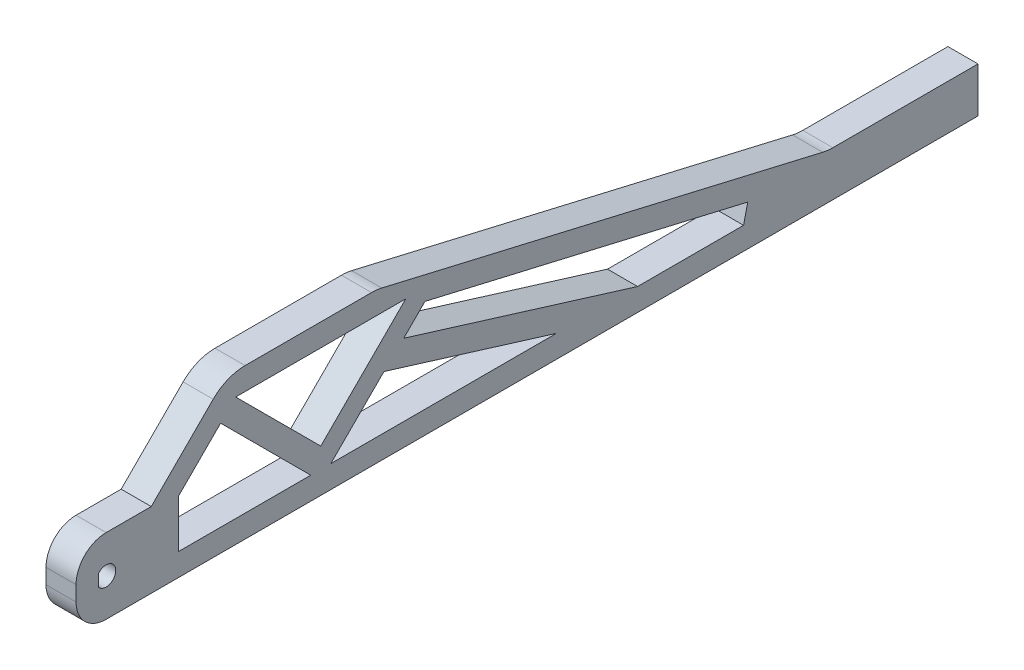
ISO-10303-21;
HEADER;
FILE_DESCRIPTION(('STEP AP214'),'2;1');
FILE_NAME('part.step','',(''),(''),'','','');
FILE_SCHEMA(('AUTOMOTIVE_DESIGN { 1 0 10303 214 1 1 1 1 }'));
ENDSEC;
DATA;
#1=APPLICATION_CONTEXT('core data for automotive mechanical design processes');
#2=APPLICATION_PROTOCOL_DEFINITION('international standard','automotive_design',2000,#1);
#3=PRODUCT_CONTEXT('',#1,'mechanical');
#4=PRODUCT('Part','Part','',(#3));
#5=PRODUCT_RELATED_PRODUCT_CATEGORY('part','',(#4));
#6=PRODUCT_DEFINITION_FORMATION('','',#4);
#7=PRODUCT_DEFINITION_CONTEXT('part definition',#1,'design');
#8=PRODUCT_DEFINITION('design','',#6,#7);
#9=PRODUCT_DEFINITION_SHAPE('','',#8);
#10=(LENGTH_UNIT() NAMED_UNIT(*) SI_UNIT(.MILLI.,.METRE.));
#11=(NAMED_UNIT(*) PLANE_ANGLE_UNIT() SI_UNIT($,.RADIAN.));
#12=(NAMED_UNIT(*) SI_UNIT($,.STERADIAN.) SOLID_ANGLE_UNIT());
#13=UNCERTAINTY_MEASURE_WITH_UNIT(LENGTH_MEASURE(1.E-05),#10,'distance_accuracy_value','');
#14=(GEOMETRIC_REPRESENTATION_CONTEXT(3) GLOBAL_UNCERTAINTY_ASSIGNED_CONTEXT((#13)) GLOBAL_UNIT_ASSIGNED_CONTEXT((#10,
#11,#12)) REPRESENTATION_CONTEXT('',''));
#15=CARTESIAN_POINT('',(0.,0.,0.));
#16=DIRECTION('',(0.,0.,1.));
#17=DIRECTION('',(1.,0.,0.));
#18=AXIS2_PLACEMENT_3D('',#15,#16,#17);
#19=CARTESIAN_POINT('',(-10.,0.,0.));
#20=DIRECTION('',(0.,0.,1.));
#21=DIRECTION('',(1.,0.,0.));
#22=AXIS2_PLACEMENT_3D('',#19,#20,#21);
#23=PLANE('',#22);
#24=DIRECTION('',(0.,-1.,0.));
#25=VECTOR('',#24,1.);
#26=CARTESIAN_POINT('',(-10.,0.,0.));
#27=LINE('',#26,#25);
#28=CARTESIAN_POINT('',(-10.,15.,0.));
#29=VERTEX_POINT('',#28);
#30=CARTESIAN_POINT('',(-10.,10.,0.));
#31=VERTEX_POINT('',#30);
#32=EDGE_CURVE('E379',#29,#31,#27,.T.);
#33=ORIENTED_EDGE('',*,*,#32,.T.);
#34=DIRECTION('',(1.,0.,0.));
#35=VECTOR('',#34,1.);
#36=CARTESIAN_POINT('',(-10.,10.,0.));
#37=LINE('',#36,#35);
#38=CARTESIAN_POINT('',(0.,10.,0.));
#39=VERTEX_POINT('',#38);
#40=EDGE_CURVE('E431',#31,#39,#37,.T.);
#41=ORIENTED_EDGE('',*,*,#40,.T.);
#42=DIRECTION('',(0.,-1.,0.));
#43=VECTOR('',#42,1.);
#44=CARTESIAN_POINT('',(0.,0.,0.));
#45=LINE('',#44,#43);
#46=CARTESIAN_POINT('',(0.,15.,0.));
#47=VERTEX_POINT('',#46);
#48=EDGE_CURVE('E374',#47,#39,#45,.T.);
#49=ORIENTED_EDGE('',*,*,#48,.F.);
#50=DIRECTION('',(1.,0.,0.));
#51=VECTOR('',#50,1.);
#52=CARTESIAN_POINT('',(-10.,15.,0.));
#53=LINE('',#52,#51);
#54=EDGE_CURVE('E425',#47,#29,#53,.F.);
#55=ORIENTED_EDGE('',*,*,#54,.T.);
#56=EDGE_LOOP('',(#33,#41,#49,#55));
#57=FACE_BOUND('',#56,.T.);
#58=ADVANCED_FACE('F33',(#57),#23,.T.);
#59=CARTESIAN_POINT('',(-10.,25.,0.));
#60=DIRECTION('',(0.,1.,0.));
#61=DIRECTION('',(0.,0.,1.));
#62=AXIS2_PLACEMENT_3D('',#59,#60,#61);
#63=PLANE('',#62);
#64=DIRECTION('',(0.,0.,1.));
#65=VECTOR('',#64,1.);
#66=CARTESIAN_POINT('',(-10.,25.,0.));
#67=LINE('',#66,#65);
#68=CARTESIAN_POINT('',(-10.,25.,-25.));
#69=VERTEX_POINT('',#68);
#70=CARTESIAN_POINT('',(-10.,25.,-10.));
#71=VERTEX_POINT('',#70);
#72=EDGE_CURVE('E398',#69,#71,#67,.T.);
#73=ORIENTED_EDGE('',*,*,#72,.T.);
#74=DIRECTION('',(1.,0.,0.));
#75=VECTOR('',#74,1.);
#76=CARTESIAN_POINT('',(-10.,25.,-10.));
#77=LINE('',#76,#75);
#78=CARTESIAN_POINT('',(0.,25.,-10.));
#79=VERTEX_POINT('',#78);
#80=EDGE_CURVE('E444',#71,#79,#77,.T.);
#81=ORIENTED_EDGE('',*,*,#80,.T.);
#82=DIRECTION('',(0.,0.,1.));
#83=VECTOR('',#82,1.);
#84=CARTESIAN_POINT('',(0.,25.,0.));
#85=LINE('',#84,#83);
#86=CARTESIAN_POINT('',(0.,25.,-25.));
#87=VERTEX_POINT('',#86);
#88=EDGE_CURVE('E383',#87,#79,#85,.T.);
#89=ORIENTED_EDGE('',*,*,#88,.F.);
#90=DIRECTION('',(1.,0.,0.));
#91=VECTOR('',#90,1.);
#92=CARTESIAN_POINT('',(-10.,25.,-25.));
#93=LINE('',#92,#91);
#94=EDGE_CURVE('E422',#69,#87,#93,.T.);
#95=ORIENTED_EDGE('',*,*,#94,.F.);
#96=EDGE_LOOP('',(#73,#81,#89,#95));
#97=FACE_BOUND('',#96,.T.);
#98=ADVANCED_FACE('F506',(#97),#63,.T.);
#99=CARTESIAN_POINT('',(-10.,25.,-25.));
#100=DIRECTION('',(0.,0.707106781186548,0.707106781186548));
#101=DIRECTION('',(0.,-0.707106781186548,0.707106781186548));
#102=AXIS2_PLACEMENT_3D('',#99,#100,#101);
#103=PLANE('',#102);
#104=DIRECTION('',(0.,-0.707106781186547,0.707106781186547));
#105=VECTOR('',#104,1.);
#106=CARTESIAN_POINT('',(0.,25.,-25.));
#107=LINE('',#106,#105);
#108=CARTESIAN_POINT('',(0.,45.6066017177982,-45.6066017177982));
#109=VERTEX_POINT('',#108);
#110=EDGE_CURVE('E418',#109,#87,#107,.T.);
#111=ORIENTED_EDGE('',*,*,#110,.F.);
#112=DIRECTION('',(1.,0.,0.));
#113=VECTOR('',#112,1.);
#114=CARTESIAN_POINT('',(-10.,45.6066017177982,-45.6066017177982));
#115=LINE('',#114,#113);
#116=CARTESIAN_POINT('',(-10.,45.6066017177982,-45.6066017177982));
#117=VERTEX_POINT('',#116);
#118=EDGE_CURVE('E48',#109,#117,#115,.F.);
#119=ORIENTED_EDGE('',*,*,#118,.T.);
#120=DIRECTION('',(0.,-0.707106781186547,0.707106781186547));
#121=VECTOR('',#120,1.);
#122=CARTESIAN_POINT('',(-10.,25.,-25.));
#123=LINE('',#122,#121);
#124=EDGE_CURVE('E396',#117,#69,#123,.T.);
#125=ORIENTED_EDGE('',*,*,#124,.T.);
#126=ORIENTED_EDGE('',*,*,#94,.T.);
#127=EDGE_LOOP('',(#111,#119,#125,#126));
#128=FACE_BOUND('',#127,.T.);
#129=ADVANCED_FACE('F529',(#128),#103,.T.);
#130=CARTESIAN_POINT('',(-10.,50.,-50.));
#131=DIRECTION('',(0.,1.,0.));
#132=DIRECTION('',(0.,0.,1.));
#133=AXIS2_PLACEMENT_3D('',#130,#131,#132);
#134=PLANE('',#133);
#135=DIRECTION('',(0.,0.,1.));
#136=VECTOR('',#135,1.);
#137=CARTESIAN_POINT('',(0.,50.,-50.));
#138=LINE('',#137,#136);
#139=CARTESIAN_POINT('',(0.,50.,-98.2731922825027));
#140=VERTEX_POINT('',#139);
#141=CARTESIAN_POINT('',(0.,50.,-56.2132034355964));
#142=VERTEX_POINT('',#141);
#143=EDGE_CURVE('E415',#140,#142,#138,.T.);
#144=ORIENTED_EDGE('',*,*,#143,.F.);
#145=DIRECTION('',(1.,0.,0.));
#146=VECTOR('',#145,1.);
#147=CARTESIAN_POINT('',(-10.,50.,-98.2731922825027));
#148=LINE('',#147,#146);
#149=CARTESIAN_POINT('',(-10.,50.,-98.2731922825027));
#150=VERTEX_POINT('',#149);
#151=EDGE_CURVE('E462',#140,#150,#148,.F.);
#152=ORIENTED_EDGE('',*,*,#151,.T.);
#153=DIRECTION('',(0.,0.,1.));
#154=VECTOR('',#153,1.);
#155=CARTESIAN_POINT('',(-10.,50.,-50.));
#156=LINE('',#155,#154);
#157=CARTESIAN_POINT('',(-10.,50.,-56.2132034355964));
#158=VERTEX_POINT('',#157);
#159=EDGE_CURVE('E394',#150,#158,#156,.T.);
#160=ORIENTED_EDGE('',*,*,#159,.T.);
#161=DIRECTION('',(1.,0.,0.));
#162=VECTOR('',#161,1.);
#163=CARTESIAN_POINT('',(-10.,50.,-56.2132034355964));
#164=LINE('',#163,#162);
#165=EDGE_CURVE('E459',#158,#142,#164,.T.);
#166=ORIENTED_EDGE('',*,*,#165,.T.);
#167=EDGE_LOOP('',(#144,#152,#160,#166));
#168=FACE_BOUND('',#167,.T.);
#169=ADVANCED_FACE('F513',(#168),#134,.T.);
#170=CARTESIAN_POINT('',(-10.,15.,-250.));
#171=DIRECTION('',(0.,0.973841209741793,-0.227229615606419));
#172=DIRECTION('',(0.,0.227229615606419,0.973841209741793));
#173=AXIS2_PLACEMENT_3D('',#170,#171,#172);
#174=PLANE('',#173);
#175=DIRECTION('',(0.,0.227229615606419,0.973841209741793));
#176=VECTOR('',#175,1.);
#177=CARTESIAN_POINT('',(0.,15.,-250.));
#178=LINE('',#177,#176);
#179=CARTESIAN_POINT('',(0.,15.3923818538731,-248.318363483401));
#180=VERTEX_POINT('',#179);
#181=CARTESIAN_POINT('',(0.,49.6076181461269,-101.681636516599));
#182=VERTEX_POINT('',#181);
#183=EDGE_CURVE('E412',#180,#182,#178,.T.);
#184=ORIENTED_EDGE('',*,*,#183,.F.);
#185=DIRECTION('',(1.,0.,0.));
#186=VECTOR('',#185,1.);
#187=CARTESIAN_POINT('',(-10.,15.3923818538731,-248.318363483401));
#188=LINE('',#187,#186);
#189=CARTESIAN_POINT('',(-10.,15.3923818538731,-248.318363483401));
#190=VERTEX_POINT('',#189);
#191=EDGE_CURVE('E453',#180,#190,#188,.F.);
#192=ORIENTED_EDGE('',*,*,#191,.T.);
#193=DIRECTION('',(0.,0.227229615606419,0.973841209741793));
#194=VECTOR('',#193,1.);
#195=CARTESIAN_POINT('',(-10.,15.,-250.));
#196=LINE('',#195,#194);
#197=CARTESIAN_POINT('',(-10.,49.6076181461269,-101.681636516599));
#198=VERTEX_POINT('',#197);
#199=EDGE_CURVE('E391',#190,#198,#196,.T.);
#200=ORIENTED_EDGE('',*,*,#199,.T.);
#201=DIRECTION('',(1.,0.,0.));
#202=VECTOR('',#201,1.);
#203=CARTESIAN_POINT('',(-10.,49.6076181461269,-101.681636516599));
#204=LINE('',#203,#202);
#205=EDGE_CURVE('E450',#198,#182,#204,.T.);
#206=ORIENTED_EDGE('',*,*,#205,.T.);
#207=EDGE_LOOP('',(#184,#192,#200,#206));
#208=FACE_BOUND('',#207,.T.);
#209=ADVANCED_FACE('F475',(#208),#174,.T.);
#210=CARTESIAN_POINT('',(-10.,15.,-300.));
#211=DIRECTION('',(0.,1.,0.));
#212=DIRECTION('',(0.,0.,1.));
#213=AXIS2_PLACEMENT_3D('',#210,#211,#212);
#214=PLANE('',#213);
#215=DIRECTION('',(0.,0.,1.));
#216=VECTOR('',#215,1.);
#217=CARTESIAN_POINT('',(-10.,15.,-300.));
#218=LINE('',#217,#216);
#219=CARTESIAN_POINT('',(-10.,15.,-300.));
#220=VERTEX_POINT('',#219);
#221=CARTESIAN_POINT('',(-10.,15.,-251.726807717497));
#222=VERTEX_POINT('',#221);
#223=EDGE_CURVE('E388',#220,#222,#218,.T.);
#224=ORIENTED_EDGE('',*,*,#223,.T.);
#225=DIRECTION('',(1.,0.,0.));
#226=VECTOR('',#225,1.);
#227=CARTESIAN_POINT('',(0.,15.,-251.726807717497));
#228=LINE('',#227,#226);
#229=CARTESIAN_POINT('',(0.,15.,-251.726807717497));
#230=VERTEX_POINT('',#229);
#231=EDGE_CURVE('E447',#222,#230,#228,.T.);
#232=ORIENTED_EDGE('',*,*,#231,.T.);
#233=DIRECTION('',(0.,0.,1.));
#234=VECTOR('',#233,1.);
#235=CARTESIAN_POINT('',(0.,15.,-300.));
#236=LINE('',#235,#234);
#237=CARTESIAN_POINT('',(0.,15.,-300.));
#238=VERTEX_POINT('',#237);
#239=EDGE_CURVE('E409',#238,#230,#236,.T.);
#240=ORIENTED_EDGE('',*,*,#239,.F.);
#241=DIRECTION('',(1.,0.,0.));
#242=VECTOR('',#241,1.);
#243=CARTESIAN_POINT('',(-10.,15.,-300.));
#244=LINE('',#243,#242);
#245=EDGE_CURVE('E426',#220,#238,#244,.T.);
#246=ORIENTED_EDGE('',*,*,#245,.F.);
#247=EDGE_LOOP('',(#224,#232,#240,#246));
#248=FACE_BOUND('',#247,.T.);
#249=ADVANCED_FACE('F483',(#248),#214,.T.);
#250=CARTESIAN_POINT('',(-10.,0.,-300.));
#251=DIRECTION('',(0.,0.,-1.));
#252=DIRECTION('',(-1.,0.,0.));
#253=AXIS2_PLACEMENT_3D('',#250,#251,#252);
#254=PLANE('',#253);
#255=DIRECTION('',(0.,1.,0.));
#256=VECTOR('',#255,1.);
#257=CARTESIAN_POINT('',(0.,0.,-300.));
#258=LINE('',#257,#256);
#259=CARTESIAN_POINT('',(0.,0.,-300.));
#260=VERTEX_POINT('',#259);
#261=EDGE_CURVE('E406',#260,#238,#258,.T.);
#262=ORIENTED_EDGE('',*,*,#261,.F.);
#263=DIRECTION('',(1.,0.,0.));
#264=VECTOR('',#263,1.);
#265=CARTESIAN_POINT('',(-10.,0.,-300.));
#266=LINE('',#265,#264);
#267=CARTESIAN_POINT('',(-10.,0.,-300.));
#268=VERTEX_POINT('',#267);
#269=EDGE_CURVE('E401',#268,#260,#266,.T.);
#270=ORIENTED_EDGE('',*,*,#269,.F.);
#271=DIRECTION('',(0.,1.,0.));
#272=VECTOR('',#271,1.);
#273=CARTESIAN_POINT('',(-10.,0.,-300.));
#274=LINE('',#273,#272);
#275=EDGE_CURVE('E385',#268,#220,#274,.T.);
#276=ORIENTED_EDGE('',*,*,#275,.T.);
#277=ORIENTED_EDGE('',*,*,#245,.T.);
#278=EDGE_LOOP('',(#262,#270,#276,#277));
#279=FACE_BOUND('',#278,.T.);
#280=ADVANCED_FACE('F486',(#279),#254,.T.);
#281=CARTESIAN_POINT('',(-10.,0.,0.));
#282=DIRECTION('',(0.,-1.,0.));
#283=DIRECTION('',(0.,0.,-1.));
#284=AXIS2_PLACEMENT_3D('',#281,#282,#283);
#285=PLANE('',#284);
#286=DIRECTION('',(0.,0.,-1.));
#287=VECTOR('',#286,1.);
#288=CARTESIAN_POINT('',(0.,0.,0.));
#289=LINE('',#288,#287);
#290=CARTESIAN_POINT('',(0.,0.,-10.));
#291=VERTEX_POINT('',#290);
#292=EDGE_CURVE('E404',#291,#260,#289,.T.);
#293=ORIENTED_EDGE('',*,*,#292,.F.);
#294=DIRECTION('',(1.,0.,0.));
#295=VECTOR('',#294,1.);
#296=CARTESIAN_POINT('',(-10.,0.,-10.));
#297=LINE('',#296,#295);
#298=CARTESIAN_POINT('',(-10.,0.,-10.));
#299=VERTEX_POINT('',#298);
#300=EDGE_CURVE('E438',#291,#299,#297,.F.);
#301=ORIENTED_EDGE('',*,*,#300,.T.);
#302=DIRECTION('',(0.,0.,-1.));
#303=VECTOR('',#302,1.);
#304=CARTESIAN_POINT('',(-10.,0.,0.));
#305=LINE('',#304,#303);
#306=EDGE_CURVE('E382',#299,#268,#305,.T.);
#307=ORIENTED_EDGE('',*,*,#306,.T.);
#308=ORIENTED_EDGE('',*,*,#269,.T.);
#309=EDGE_LOOP('',(#293,#301,#307,#308));
#310=FACE_BOUND('',#309,.T.);
#311=ADVANCED_FACE('F533',(#310),#285,.T.);
#312=CARTESIAN_POINT('',(-10.,0.,0.));
#313=DIRECTION('',(-1.,0.,0.));
#314=DIRECTION('',(0.,0.,1.));
#315=AXIS2_PLACEMENT_3D('',#312,#313,#314);
#316=PLANE('',#315);
#317=DIRECTION('',(0.,-0.707106781186548,0.707106781186548));
#318=VECTOR('',#317,1.);
#319=CARTESIAN_POINT('',(-10.,37.4726306580054,-48.0792323758036));
#320=LINE('',#319,#318);
#321=CARTESIAN_POINT('',(-10.,37.4726306580054,-48.0792323758036));
#322=VERTEX_POINT('',#321);
#323=CARTESIAN_POINT('',(-10.,23.5,-34.1066017177982));
#324=VERTEX_POINT('',#323);
#325=EDGE_CURVE('E299',#322,#324,#320,.T.);
#326=ORIENTED_EDGE('',*,*,#325,.T.);
#327=DIRECTION('',(0.,-1.,0.));
#328=VECTOR('',#327,1.);
#329=CARTESIAN_POINT('',(-10.,23.5,-34.1066017177982));
#330=LINE('',#329,#328);
#331=CARTESIAN_POINT('',(-10.,7.5,-34.1066017177982));
#332=VERTEX_POINT('',#331);
#333=EDGE_CURVE('E302',#324,#332,#330,.T.);
#334=ORIENTED_EDGE('',*,*,#333,.T.);
#335=DIRECTION('',(0.,0.,-1.));
#336=VECTOR('',#335,1.);
#337=CARTESIAN_POINT('',(-10.,7.5,-34.1066017177982));
#338=LINE('',#337,#336);
#339=CARTESIAN_POINT('',(-10.,7.5,-78.0518630338093));
#340=VERTEX_POINT('',#339);
#341=EDGE_CURVE('E306',#332,#340,#338,.T.);
#342=ORIENTED_EDGE('',*,*,#341,.T.);
#343=DIRECTION('',(0.,0.707106781186543,0.707106781186552));
#344=VECTOR('',#343,1.);
#345=CARTESIAN_POINT('',(-10.,7.5,-78.0518630338093));
#346=LINE('',#345,#344);
#347=EDGE_CURVE('E309',#340,#322,#346,.T.);
#348=ORIENTED_EDGE('',*,*,#347,.T.);
#349=EDGE_LOOP('',(#326,#334,#342,#348));
#350=FACE_BOUND('',#349,.T.);
#351=DIRECTION('',(0.,0.294627825494395,0.955612078431643));
#352=VECTOR('',#351,1.);
#353=CARTESIAN_POINT('',(-10.,7.5,-159.744277132274));
#354=LINE('',#353,#352);
#355=CARTESIAN_POINT('',(-10.,7.5,-159.744277132274));
#356=VERTEX_POINT('',#355);
#357=CARTESIAN_POINT('',(-10.,25.1776695296637,-102.407552426376));
#358=VERTEX_POINT('',#357);
#359=EDGE_CURVE('E333',#356,#358,#354,.T.);
#360=ORIENTED_EDGE('',*,*,#359,.T.);
#361=DIRECTION('',(0.,-0.707106781186548,0.707106781186547));
#362=VECTOR('',#361,1.);
#363=CARTESIAN_POINT('',(-10.,25.1776695296637,-102.407552426376));
#364=LINE('',#363,#362);
#365=CARTESIAN_POINT('',(-10.,7.5,-84.729882896712));
#366=VERTEX_POINT('',#365);
#367=EDGE_CURVE('E336',#358,#366,#364,.T.);
#368=ORIENTED_EDGE('',*,*,#367,.T.);
#369=DIRECTION('',(0.,0.,-1.));
#370=VECTOR('',#369,1.);
#371=CARTESIAN_POINT('',(-10.,7.5,-84.729882896712));
#372=LINE('',#371,#370);
#373=EDGE_CURVE('E340',#366,#356,#372,.T.);
#374=ORIENTED_EDGE('',*,*,#373,.T.);
#375=EDGE_LOOP('',(#360,#368,#374));
#376=FACE_BOUND('',#375,.T.);
#377=DIRECTION('',(0.,-0.707106781186547,0.707106781186548));
#378=VECTOR('',#377,1.);
#379=CARTESIAN_POINT('',(-10.,31.481885157312,-108.981444175768));
#380=LINE('',#379,#378);
#381=CARTESIAN_POINT('',(-10.,38.5529529691774,-116.052511987634));
#382=VERTEX_POINT('',#381);
#383=CARTESIAN_POINT('',(-10.,31.481885157312,-108.981444175768));
#384=VERTEX_POINT('',#383);
#385=EDGE_CURVE('E235',#382,#384,#380,.T.);
#386=ORIENTED_EDGE('',*,*,#385,.T.);
#387=DIRECTION('',(0.,-0.294627825494395,-0.955612078431643));
#388=VECTOR('',#387,1.);
#389=CARTESIAN_POINT('',(-10.,7.5,-186.765608252708));
#390=LINE('',#389,#388);
#391=CARTESIAN_POINT('',(-10.,7.49999999999999,-186.765608252708));
#392=VERTEX_POINT('',#391);
#393=EDGE_CURVE('E247',#384,#392,#390,.T.);
#394=ORIENTED_EDGE('',*,*,#393,.T.);
#395=DIRECTION('',(0.,0.,-1.));
#396=VECTOR('',#395,1.);
#397=CARTESIAN_POINT('',(-10.,7.50000000000001,-222.022310426966));
#398=LINE('',#397,#396);
#399=CARTESIAN_POINT('',(-10.,7.50000000000001,-222.022310426966));
#400=VERTEX_POINT('',#399);
#401=EDGE_CURVE('E251',#392,#400,#398,.T.);
#402=ORIENTED_EDGE('',*,*,#401,.T.);
#403=DIRECTION('',(0.,0.973841209741793,-0.22722961560642));
#404=VECTOR('',#403,1.);
#405=CARTESIAN_POINT('',(-10.,13.5,-223.422310426966));
#406=LINE('',#405,#404);
#407=CARTESIAN_POINT('',(-10.,13.5,-223.422310426966));
#408=VERTEX_POINT('',#407);
#409=EDGE_CURVE('E264',#400,#408,#406,.T.);
#410=ORIENTED_EDGE('',*,*,#409,.T.);
#411=DIRECTION('',(0.,0.227229615606419,0.973841209741793));
#412=VECTOR('',#411,1.);
#413=CARTESIAN_POINT('',(-10.,38.5529529691774,-116.052511987634));
#414=LINE('',#413,#412);
#415=EDGE_CURVE('E243',#408,#382,#414,.T.);
#416=ORIENTED_EDGE('',*,*,#415,.T.);
#417=EDGE_LOOP('',(#386,#394,#402,#410,#416));
#418=FACE_BOUND('',#417,.T.);
#419=CARTESIAN_POINT('',(-10.,12.5,-10.));
#420=DIRECTION('',(1.,0.,0.));
#421=DIRECTION('',(0.,0.,-1.));
#422=AXIS2_PLACEMENT_3D('',#419,#420,#421);
#423=CIRCLE('',#422,3.2);
#424=CARTESIAN_POINT('',(-10.,10.5536187423837,-7.46));
#425=VERTEX_POINT('',#424);
#426=CARTESIAN_POINT('',(-10.,14.4463812576163,-7.46));
#427=VERTEX_POINT('',#426);
#428=EDGE_CURVE('E284',#425,#427,#423,.T.);
#429=ORIENTED_EDGE('',*,*,#428,.T.);
#430=DIRECTION('',(0.,-1.,0.));
#431=VECTOR('',#430,1.);
#432=CARTESIAN_POINT('',(-10.,14.4463812576163,-7.46));
#433=LINE('',#432,#431);
#434=EDGE_CURVE('E287',#427,#425,#433,.T.);
#435=ORIENTED_EDGE('',*,*,#434,.T.);
#436=EDGE_LOOP('',(#429,#435));
#437=FACE_BOUND('',#436,.T.);
#438=DIRECTION('',(0.,-0.707106781186544,-0.707106781186551));
#439=VECTOR('',#438,1.);
#440=CARTESIAN_POINT('',(-10.,14.2157287525383,-81.3908729652602));
#441=LINE('',#440,#439);
#442=CARTESIAN_POINT('',(-10.,42.5,-53.1066017177982));
#443=VERTEX_POINT('',#442);
#444=CARTESIAN_POINT('',(-10.,14.2157287525383,-81.3908729652602));
#445=VERTEX_POINT('',#444);
#446=EDGE_CURVE('E355',#443,#445,#441,.T.);
#447=ORIENTED_EDGE('',*,*,#446,.T.);
#448=DIRECTION('',(0.,0.707106781186539,-0.707106781186556));
#449=VECTOR('',#448,1.);
#450=CARTESIAN_POINT('',(-10.,42.5,-109.675144212723));
#451=LINE('',#450,#449);
#452=CARTESIAN_POINT('',(-10.,42.5,-109.675144212723));
#453=VERTEX_POINT('',#452);
#454=EDGE_CURVE('E358',#445,#453,#451,.T.);
#455=ORIENTED_EDGE('',*,*,#454,.T.);
#456=DIRECTION('',(0.,0.,1.));
#457=VECTOR('',#456,1.);
#458=CARTESIAN_POINT('',(-10.,42.5,-53.1066017177982));
#459=LINE('',#458,#457);
#460=EDGE_CURVE('E362',#453,#443,#459,.T.);
#461=ORIENTED_EDGE('',*,*,#460,.T.);
#462=EDGE_LOOP('',(#447,#455,#461));
#463=FACE_BOUND('',#462,.T.);
#464=ORIENTED_EDGE('',*,*,#159,.F.);
#465=CARTESIAN_POINT('',(-10.,35.,-98.2731922825027));
#466=DIRECTION('',(-1.,0.,0.));
#467=DIRECTION('',(0.,0.,1.));
#468=AXIS2_PLACEMENT_3D('',#465,#466,#467);
#469=CIRCLE('',#468,15.);
#470=EDGE_CURVE('E465',#150,#198,#469,.T.);
#471=ORIENTED_EDGE('',*,*,#470,.T.);
#472=ORIENTED_EDGE('',*,*,#199,.F.);
#473=CARTESIAN_POINT('',(-10.,30.,-251.726807717497));
#474=DIRECTION('',(-1.,0.,0.));
#475=DIRECTION('',(0.,0.,1.));
#476=AXIS2_PLACEMENT_3D('',#473,#474,#475);
#477=CIRCLE('',#476,15.);
#478=EDGE_CURVE('E11',#190,#222,#477,.F.);
#479=ORIENTED_EDGE('',*,*,#478,.T.);
#480=ORIENTED_EDGE('',*,*,#223,.F.);
#481=ORIENTED_EDGE('',*,*,#275,.F.);
#482=ORIENTED_EDGE('',*,*,#306,.F.);
#483=CARTESIAN_POINT('',(-10.,10.,-10.));
#484=DIRECTION('',(-1.,0.,0.));
#485=DIRECTION('',(0.,0.,1.));
#486=AXIS2_PLACEMENT_3D('',#483,#484,#485);
#487=CIRCLE('',#486,10.);
#488=EDGE_CURVE('E442',#299,#31,#487,.T.);
#489=ORIENTED_EDGE('',*,*,#488,.T.);
#490=ORIENTED_EDGE('',*,*,#32,.F.);
#491=CARTESIAN_POINT('',(-10.,15.,-10.));
#492=DIRECTION('',(-1.,0.,0.));
#493=DIRECTION('',(0.,0.,1.));
#494=AXIS2_PLACEMENT_3D('',#491,#492,#493);
#495=CIRCLE('',#494,10.);
#496=EDGE_CURVE('E440',#29,#71,#495,.T.);
#497=ORIENTED_EDGE('',*,*,#496,.T.);
#498=ORIENTED_EDGE('',*,*,#72,.F.);
#499=ORIENTED_EDGE('',*,*,#124,.F.);
#500=CARTESIAN_POINT('',(-10.,35.,-56.2132034355964));
#501=DIRECTION('',(-1.,0.,0.));
#502=DIRECTION('',(0.,0.,1.));
#503=AXIS2_PLACEMENT_3D('',#500,#501,#502);
#504=CIRCLE('',#503,15.);
#505=EDGE_CURVE('E55',#117,#158,#504,.T.);
#506=ORIENTED_EDGE('',*,*,#505,.T.);
#507=EDGE_LOOP('',(#464,#471,#472,#479,#480,#481,#482,#489,#490,#497,#498,#499,#506));
#508=FACE_BOUND('',#507,.T.);
#509=ADVANCED_FACE('F253',(#350,#376,#418,#437,#463,#508),#316,.T.);
#510=CARTESIAN_POINT('',(0.,0.,0.));
#511=DIRECTION('',(-1.,0.,0.));
#512=DIRECTION('',(0.,0.,1.));
#513=AXIS2_PLACEMENT_3D('',#510,#511,#512);
#514=PLANE('',#513);
#515=DIRECTION('',(0.,-1.,0.));
#516=VECTOR('',#515,1.);
#517=CARTESIAN_POINT('',(0.,23.5,-34.1066017177982));
#518=LINE('',#517,#516);
#519=CARTESIAN_POINT('',(0.,23.5,-34.1066017177982));
#520=VERTEX_POINT('',#519);
#521=CARTESIAN_POINT('',(0.,7.5,-34.1066017177982));
#522=VERTEX_POINT('',#521);
#523=EDGE_CURVE('E315',#520,#522,#518,.T.);
#524=ORIENTED_EDGE('',*,*,#523,.F.);
#525=DIRECTION('',(0.,-0.707106781186548,0.707106781186548));
#526=VECTOR('',#525,1.);
#527=CARTESIAN_POINT('',(0.,37.4726306580054,-48.0792323758036));
#528=LINE('',#527,#526);
#529=CARTESIAN_POINT('',(0.,37.4726306580054,-48.0792323758036));
#530=VERTEX_POINT('',#529);
#531=EDGE_CURVE('E313',#530,#520,#528,.T.);
#532=ORIENTED_EDGE('',*,*,#531,.F.);
#533=DIRECTION('',(0.,0.707106781186543,0.707106781186552));
#534=VECTOR('',#533,1.);
#535=CARTESIAN_POINT('',(0.,7.5,-78.0518630338093));
#536=LINE('',#535,#534);
#537=CARTESIAN_POINT('',(0.,7.5,-78.0518630338093));
#538=VERTEX_POINT('',#537);
#539=EDGE_CURVE('E303',#538,#530,#536,.T.);
#540=ORIENTED_EDGE('',*,*,#539,.F.);
#541=DIRECTION('',(0.,0.,-1.));
#542=VECTOR('',#541,1.);
#543=CARTESIAN_POINT('',(0.,7.5,-34.1066017177982));
#544=LINE('',#543,#542);
#545=EDGE_CURVE('E319',#522,#538,#544,.T.);
#546=ORIENTED_EDGE('',*,*,#545,.F.);
#547=EDGE_LOOP('',(#524,#532,#540,#546));
#548=FACE_BOUND('',#547,.T.);
#549=DIRECTION('',(0.,-0.707106781186548,0.707106781186547));
#550=VECTOR('',#549,1.);
#551=CARTESIAN_POINT('',(0.,25.1776695296637,-102.407552426376));
#552=LINE('',#551,#550);
#553=CARTESIAN_POINT('',(0.,25.1776695296637,-102.407552426376));
#554=VERTEX_POINT('',#553);
#555=CARTESIAN_POINT('',(0.,7.5,-84.729882896712));
#556=VERTEX_POINT('',#555);
#557=EDGE_CURVE('E345',#554,#556,#552,.T.);
#558=ORIENTED_EDGE('',*,*,#557,.F.);
#559=DIRECTION('',(0.,0.294627825494395,0.955612078431643));
#560=VECTOR('',#559,1.);
#561=CARTESIAN_POINT('',(0.,7.5,-159.744277132274));
#562=LINE('',#561,#560);
#563=CARTESIAN_POINT('',(0.,7.5,-159.744277132274));
#564=VERTEX_POINT('',#563);
#565=EDGE_CURVE('E278',#564,#554,#562,.T.);
#566=ORIENTED_EDGE('',*,*,#565,.F.);
#567=DIRECTION('',(0.,0.,-1.));
#568=VECTOR('',#567,1.);
#569=CARTESIAN_POINT('',(0.,7.5,-84.729882896712));
#570=LINE('',#569,#568);
#571=EDGE_CURVE('E337',#556,#564,#570,.T.);
#572=ORIENTED_EDGE('',*,*,#571,.F.);
#573=EDGE_LOOP('',(#558,#566,#572));
#574=FACE_BOUND('',#573,.T.);
#575=DIRECTION('',(0.,-0.294627825494395,-0.955612078431643));
#576=VECTOR('',#575,1.);
#577=CARTESIAN_POINT('',(0.,7.5,-186.765608252708));
#578=LINE('',#577,#576);
#579=CARTESIAN_POINT('',(0.,31.481885157312,-108.981444175768));
#580=VERTEX_POINT('',#579);
#581=CARTESIAN_POINT('',(0.,7.5,-186.765608252708));
#582=VERTEX_POINT('',#581);
#583=EDGE_CURVE('E268',#580,#582,#578,.T.);
#584=ORIENTED_EDGE('',*,*,#583,.F.);
#585=DIRECTION('',(0.,-0.707106781186547,0.707106781186548));
#586=VECTOR('',#585,1.);
#587=CARTESIAN_POINT('',(0.,31.481885157312,-108.981444175768));
#588=LINE('',#587,#586);
#589=CARTESIAN_POINT('',(0.,38.5529529691774,-116.052511987634));
#590=VERTEX_POINT('',#589);
#591=EDGE_CURVE('E238',#590,#580,#588,.T.);
#592=ORIENTED_EDGE('',*,*,#591,.F.);
#593=DIRECTION('',(0.,0.227229615606419,0.973841209741793));
#594=VECTOR('',#593,1.);
#595=CARTESIAN_POINT('',(0.,38.5529529691774,-116.052511987634));
#596=LINE('',#595,#594);
#597=CARTESIAN_POINT('',(0.,13.5,-223.422310426966));
#598=VERTEX_POINT('',#597);
#599=EDGE_CURVE('E257',#598,#590,#596,.T.);
#600=ORIENTED_EDGE('',*,*,#599,.F.);
#601=DIRECTION('',(0.,0.973841209741793,-0.22722961560642));
#602=VECTOR('',#601,1.);
#603=CARTESIAN_POINT('',(0.,13.5,-223.422310426966));
#604=LINE('',#603,#602);
#605=CARTESIAN_POINT('',(0.,7.50000000000001,-222.022310426966));
#606=VERTEX_POINT('',#605);
#607=EDGE_CURVE('E260',#606,#598,#604,.T.);
#608=ORIENTED_EDGE('',*,*,#607,.F.);
#609=DIRECTION('',(0.,0.,-1.));
#610=VECTOR('',#609,1.);
#611=CARTESIAN_POINT('',(0.,7.50000000000001,-222.022310426966));
#612=LINE('',#611,#610);
#613=EDGE_CURVE('E271',#582,#606,#612,.T.);
#614=ORIENTED_EDGE('',*,*,#613,.F.);
#615=EDGE_LOOP('',(#584,#592,#600,#608,#614));
#616=FACE_BOUND('',#615,.T.);
#617=DIRECTION('',(0.,-1.,0.));
#618=VECTOR('',#617,1.);
#619=CARTESIAN_POINT('',(0.,14.4463812576163,-7.46));
#620=LINE('',#619,#618);
#621=CARTESIAN_POINT('',(0.,14.4463812576163,-7.46));
#622=VERTEX_POINT('',#621);
#623=CARTESIAN_POINT('',(0.,10.5536187423837,-7.46));
#624=VERTEX_POINT('',#623);
#625=EDGE_CURVE('E288',#622,#624,#620,.T.);
#626=ORIENTED_EDGE('',*,*,#625,.F.);
#627=CARTESIAN_POINT('',(0.,12.5,-10.));
#628=DIRECTION('',(1.,0.,0.));
#629=DIRECTION('',(0.,0.,-1.));
#630=AXIS2_PLACEMENT_3D('',#627,#628,#629);
#631=CIRCLE('',#630,3.2);
#632=EDGE_CURVE('E292',#624,#622,#631,.T.);
#633=ORIENTED_EDGE('',*,*,#632,.F.);
#634=EDGE_LOOP('',(#626,#633));
#635=FACE_BOUND('',#634,.T.);
#636=DIRECTION('',(0.,0.707106781186539,-0.707106781186556));
#637=VECTOR('',#636,1.);
#638=CARTESIAN_POINT('',(0.,42.5,-109.675144212723));
#639=LINE('',#638,#637);
#640=CARTESIAN_POINT('',(0.,14.2157287525383,-81.3908729652602));
#641=VERTEX_POINT('',#640);
#642=CARTESIAN_POINT('',(0.,42.5,-109.675144212723));
#643=VERTEX_POINT('',#642);
#644=EDGE_CURVE('E367',#641,#643,#639,.T.);
#645=ORIENTED_EDGE('',*,*,#644,.F.);
#646=DIRECTION('',(0.,-0.707106781186544,-0.707106781186551));
#647=VECTOR('',#646,1.);
#648=CARTESIAN_POINT('',(0.,14.2157287525383,-81.3908729652602));
#649=LINE('',#648,#647);
#650=CARTESIAN_POINT('',(0.,42.5,-53.1066017177982));
#651=VERTEX_POINT('',#650);
#652=EDGE_CURVE('E326',#651,#641,#649,.T.);
#653=ORIENTED_EDGE('',*,*,#652,.F.);
#654=DIRECTION('',(0.,0.,1.));
#655=VECTOR('',#654,1.);
#656=CARTESIAN_POINT('',(0.,42.5,-53.1066017177982));
#657=LINE('',#656,#655);
#658=EDGE_CURVE('E359',#643,#651,#657,.T.);
#659=ORIENTED_EDGE('',*,*,#658,.F.);
#660=EDGE_LOOP('',(#645,#653,#659));
#661=FACE_BOUND('',#660,.T.);
#662=ORIENTED_EDGE('',*,*,#183,.T.);
#663=CARTESIAN_POINT('',(0.,35.,-98.2731922825027));
#664=DIRECTION('',(-1.,0.,0.));
#665=DIRECTION('',(0.,0.,1.));
#666=AXIS2_PLACEMENT_3D('',#663,#664,#665);
#667=CIRCLE('',#666,15.);
#668=EDGE_CURVE('E457',#182,#140,#667,.F.);
#669=ORIENTED_EDGE('',*,*,#668,.T.);
#670=ORIENTED_EDGE('',*,*,#143,.T.);
#671=CARTESIAN_POINT('',(0.,35.,-56.2132034355964));
#672=DIRECTION('',(-1.,0.,0.));
#673=DIRECTION('',(0.,0.,1.));
#674=AXIS2_PLACEMENT_3D('',#671,#672,#673);
#675=CIRCLE('',#674,15.);
#676=EDGE_CURVE('E455',#142,#109,#675,.F.);
#677=ORIENTED_EDGE('',*,*,#676,.T.);
#678=ORIENTED_EDGE('',*,*,#110,.T.);
#679=ORIENTED_EDGE('',*,*,#88,.T.);
#680=CARTESIAN_POINT('',(0.,15.,-10.));
#681=DIRECTION('',(-1.,0.,0.));
#682=DIRECTION('',(0.,0.,1.));
#683=AXIS2_PLACEMENT_3D('',#680,#681,#682);
#684=CIRCLE('',#683,10.);
#685=EDGE_CURVE('E434',#79,#47,#684,.F.);
#686=ORIENTED_EDGE('',*,*,#685,.T.);
#687=ORIENTED_EDGE('',*,*,#48,.T.);
#688=CARTESIAN_POINT('',(0.,10.,-10.));
#689=DIRECTION('',(-1.,0.,0.));
#690=DIRECTION('',(0.,0.,1.));
#691=AXIS2_PLACEMENT_3D('',#688,#689,#690);
#692=CIRCLE('',#691,10.);
#693=EDGE_CURVE('E436',#39,#291,#692,.F.);
#694=ORIENTED_EDGE('',*,*,#693,.T.);
#695=ORIENTED_EDGE('',*,*,#292,.T.);
#696=ORIENTED_EDGE('',*,*,#261,.T.);
#697=ORIENTED_EDGE('',*,*,#239,.T.);
#698=CARTESIAN_POINT('',(0.,30.,-251.726807717497));
#699=DIRECTION('',(-1.,0.,0.));
#700=DIRECTION('',(0.,0.,1.));
#701=AXIS2_PLACEMENT_3D('',#698,#699,#700);
#702=CIRCLE('',#701,15.);
#703=EDGE_CURVE('E41',#230,#180,#702,.T.);
#704=ORIENTED_EDGE('',*,*,#703,.T.);
#705=EDGE_LOOP('',(#662,#669,#670,#677,#678,#679,#686,#687,#694,#695,#696,#697,#704));
#706=FACE_BOUND('',#705,.T.);
#707=ADVANCED_FACE('F469',(#548,#574,#616,#635,#661,#706),#514,.F.);
#708=CARTESIAN_POINT('',(-10.,14.2157287525383,-81.3908729652602));
#709=DIRECTION('',(0.,-0.707106781186551,0.707106781186544));
#710=DIRECTION('',(0.,-0.707106781186544,-0.707106781186551));
#711=AXIS2_PLACEMENT_3D('',#708,#709,#710);
#712=PLANE('',#711);
#713=ORIENTED_EDGE('',*,*,#652,.T.);
#714=DIRECTION('',(1.,0.,0.));
#715=VECTOR('',#714,1.);
#716=CARTESIAN_POINT('',(-10.,14.2157287525383,-81.3908729652602));
#717=LINE('',#716,#715);
#718=EDGE_CURVE('E365',#445,#641,#717,.T.);
#719=ORIENTED_EDGE('',*,*,#718,.F.);
#720=ORIENTED_EDGE('',*,*,#446,.F.);
#721=DIRECTION('',(1.,0.,0.));
#722=VECTOR('',#721,1.);
#723=CARTESIAN_POINT('',(-10.,42.5,-53.1066017177982));
#724=LINE('',#723,#722);
#725=EDGE_CURVE('E372',#443,#651,#724,.T.);
#726=ORIENTED_EDGE('',*,*,#725,.T.);
#727=EDGE_LOOP('',(#713,#719,#720,#726));
#728=FACE_BOUND('',#727,.T.);
#729=ADVANCED_FACE('F568',(#728),#712,.F.);
#730=CARTESIAN_POINT('',(-10.,42.5,-53.1066017177982));
#731=DIRECTION('',(0.,1.,0.));
#732=DIRECTION('',(0.,0.,1.));
#733=AXIS2_PLACEMENT_3D('',#730,#731,#732);
#734=PLANE('',#733);
#735=ORIENTED_EDGE('',*,*,#658,.T.);
#736=ORIENTED_EDGE('',*,*,#725,.F.);
#737=ORIENTED_EDGE('',*,*,#460,.F.);
#738=DIRECTION('',(1.,0.,0.));
#739=VECTOR('',#738,1.);
#740=CARTESIAN_POINT('',(-10.,42.5,-109.675144212723));
#741=LINE('',#740,#739);
#742=EDGE_CURVE('E375',#453,#643,#741,.T.);
#743=ORIENTED_EDGE('',*,*,#742,.T.);
#744=EDGE_LOOP('',(#735,#736,#737,#743));
#745=FACE_BOUND('',#744,.T.);
#746=ADVANCED_FACE('F765',(#745),#734,.F.);
#747=CARTESIAN_POINT('',(-10.,42.5,-109.675144212723));
#748=DIRECTION('',(0.,-0.707106781186556,-0.707106781186539));
#749=DIRECTION('',(0.,0.707106781186539,-0.707106781186556));
#750=AXIS2_PLACEMENT_3D('',#747,#748,#749);
#751=PLANE('',#750);
#752=ORIENTED_EDGE('',*,*,#644,.T.);
#753=ORIENTED_EDGE('',*,*,#742,.F.);
#754=ORIENTED_EDGE('',*,*,#454,.F.);
#755=ORIENTED_EDGE('',*,*,#718,.T.);
#756=EDGE_LOOP('',(#752,#753,#754,#755));
#757=FACE_BOUND('',#756,.T.);
#758=ADVANCED_FACE('F756',(#757),#751,.F.);
#759=CARTESIAN_POINT('',(-10.,12.5,-10.));
#760=DIRECTION('',(1.,0.,0.));
#761=DIRECTION('',(0.,0.,-1.));
#762=AXIS2_PLACEMENT_3D('',#759,#760,#761);
#763=CYLINDRICAL_SURFACE('',#762,3.2);
#764=ORIENTED_EDGE('',*,*,#632,.T.);
#765=DIRECTION('',(1.,0.,0.));
#766=VECTOR('',#765,1.);
#767=CARTESIAN_POINT('',(-10.,14.4463812576163,-7.46));
#768=LINE('',#767,#766);
#769=EDGE_CURVE('E291',#427,#622,#768,.T.);
#770=ORIENTED_EDGE('',*,*,#769,.F.);
#771=ORIENTED_EDGE('',*,*,#428,.F.);
#772=DIRECTION('',(1.,0.,0.));
#773=VECTOR('',#772,1.);
#774=CARTESIAN_POINT('',(-10.,10.5536187423837,-7.46));
#775=LINE('',#774,#773);
#776=EDGE_CURVE('E269',#425,#624,#775,.T.);
#777=ORIENTED_EDGE('',*,*,#776,.T.);
#778=EDGE_LOOP('',(#764,#770,#771,#777));
#779=FACE_BOUND('',#778,.T.);
#780=ADVANCED_FACE('F747',(#779),#763,.F.);
#781=CARTESIAN_POINT('',(-10.,14.4463812576163,-7.46));
#782=DIRECTION('',(0.,0.,1.));
#783=DIRECTION('',(1.,0.,0.));
#784=AXIS2_PLACEMENT_3D('',#781,#782,#783);
#785=PLANE('',#784);
#786=ORIENTED_EDGE('',*,*,#625,.T.);
#787=ORIENTED_EDGE('',*,*,#776,.F.);
#788=ORIENTED_EDGE('',*,*,#434,.F.);
#789=ORIENTED_EDGE('',*,*,#769,.T.);
#790=EDGE_LOOP('',(#786,#787,#788,#789));
#791=FACE_BOUND('',#790,.T.);
#792=ADVANCED_FACE('F739',(#791),#785,.F.);
#793=CARTESIAN_POINT('',(-10.,31.481885157312,-108.981444175768));
#794=DIRECTION('',(0.,0.707106781186548,0.707106781186547));
#795=DIRECTION('',(0.,-0.707106781186547,0.707106781186548));
#796=AXIS2_PLACEMENT_3D('',#793,#794,#795);
#797=PLANE('',#796);
#798=ORIENTED_EDGE('',*,*,#591,.T.);
#799=DIRECTION('',(1.,0.,0.));
#800=VECTOR('',#799,1.);
#801=CARTESIAN_POINT('',(-10.,31.481885157312,-108.981444175768));
#802=LINE('',#801,#800);
#803=EDGE_CURVE('E231',#384,#580,#802,.T.);
#804=ORIENTED_EDGE('',*,*,#803,.F.);
#805=ORIENTED_EDGE('',*,*,#385,.F.);
#806=DIRECTION('',(1.,0.,0.));
#807=VECTOR('',#806,1.);
#808=CARTESIAN_POINT('',(-10.,38.5529529691774,-116.052511987634));
#809=LINE('',#808,#807);
#810=EDGE_CURVE('E276',#382,#590,#809,.T.);
#811=ORIENTED_EDGE('',*,*,#810,.T.);
#812=EDGE_LOOP('',(#798,#804,#805,#811));
#813=FACE_BOUND('',#812,.T.);
#814=ADVANCED_FACE('F233',(#813),#797,.F.);
#815=CARTESIAN_POINT('',(-10.,38.5529529691774,-116.052511987634));
#816=DIRECTION('',(0.,0.973841209741793,-0.227229615606419));
#817=DIRECTION('',(0.,0.227229615606419,0.973841209741793));
#818=AXIS2_PLACEMENT_3D('',#815,#816,#817);
#819=PLANE('',#818);
#820=ORIENTED_EDGE('',*,*,#599,.T.);
#821=ORIENTED_EDGE('',*,*,#810,.F.);
#822=ORIENTED_EDGE('',*,*,#415,.F.);
#823=DIRECTION('',(1.,0.,0.));
#824=VECTOR('',#823,1.);
#825=CARTESIAN_POINT('',(-10.,13.5,-223.422310426966));
#826=LINE('',#825,#824);
#827=EDGE_CURVE('E279',#408,#598,#826,.T.);
#828=ORIENTED_EDGE('',*,*,#827,.T.);
#829=EDGE_LOOP('',(#820,#821,#822,#828));
#830=FACE_BOUND('',#829,.T.);
#831=ADVANCED_FACE('F722',(#830),#819,.F.);
#832=CARTESIAN_POINT('',(-10.,13.5,-223.422310426966));
#833=DIRECTION('',(0.,-0.22722961560642,-0.973841209741793));
#834=DIRECTION('',(0.,0.973841209741793,-0.22722961560642));
#835=AXIS2_PLACEMENT_3D('',#832,#833,#834);
#836=PLANE('',#835);
#837=ORIENTED_EDGE('',*,*,#607,.T.);
#838=ORIENTED_EDGE('',*,*,#827,.F.);
#839=ORIENTED_EDGE('',*,*,#409,.F.);
#840=DIRECTION('',(1.,0.,0.));
#841=VECTOR('',#840,1.);
#842=CARTESIAN_POINT('',(-10.,7.50000000000001,-222.022310426966));
#843=LINE('',#842,#841);
#844=EDGE_CURVE('E281',#400,#606,#843,.T.);
#845=ORIENTED_EDGE('',*,*,#844,.T.);
#846=EDGE_LOOP('',(#837,#838,#839,#845));
#847=FACE_BOUND('',#846,.T.);
#848=ADVANCED_FACE('F713',(#847),#836,.F.);
#849=CARTESIAN_POINT('',(-10.,7.50000000000001,-222.022310426966));
#850=DIRECTION('',(0.,-1.,0.));
#851=DIRECTION('',(0.,0.,-1.));
#852=AXIS2_PLACEMENT_3D('',#849,#850,#851);
#853=PLANE('',#852);
#854=ORIENTED_EDGE('',*,*,#613,.T.);
#855=ORIENTED_EDGE('',*,*,#844,.F.);
#856=ORIENTED_EDGE('',*,*,#401,.F.);
#857=DIRECTION('',(1.,0.,0.));
#858=VECTOR('',#857,1.);
#859=CARTESIAN_POINT('',(-10.,7.5,-186.765608252708));
#860=LINE('',#859,#858);
#861=EDGE_CURVE('E242',#392,#582,#860,.T.);
#862=ORIENTED_EDGE('',*,*,#861,.T.);
#863=EDGE_LOOP('',(#854,#855,#856,#862));
#864=FACE_BOUND('',#863,.T.);
#865=ADVANCED_FACE('F705',(#864),#853,.F.);
#866=CARTESIAN_POINT('',(-10.,7.5,-186.765608252708));
#867=DIRECTION('',(0.,-0.955612078431643,0.294627825494395));
#868=DIRECTION('',(0.,-0.294627825494395,-0.955612078431643));
#869=AXIS2_PLACEMENT_3D('',#866,#867,#868);
#870=PLANE('',#869);
#871=ORIENTED_EDGE('',*,*,#583,.T.);
#872=ORIENTED_EDGE('',*,*,#861,.F.);
#873=ORIENTED_EDGE('',*,*,#393,.F.);
#874=ORIENTED_EDGE('',*,*,#803,.T.);
#875=EDGE_LOOP('',(#871,#872,#873,#874));
#876=FACE_BOUND('',#875,.T.);
#877=ADVANCED_FACE('F248',(#876),#870,.F.);
#878=CARTESIAN_POINT('',(-10.,7.5,-159.744277132274));
#879=DIRECTION('',(0.,0.955612078431643,-0.294627825494395));
#880=DIRECTION('',(0.,0.294627825494395,0.955612078431643));
#881=AXIS2_PLACEMENT_3D('',#878,#879,#880);
#882=PLANE('',#881);
#883=ORIENTED_EDGE('',*,*,#565,.T.);
#884=DIRECTION('',(1.,0.,0.));
#885=VECTOR('',#884,1.);
#886=CARTESIAN_POINT('',(-10.,25.1776695296637,-102.407552426376));
#887=LINE('',#886,#885);
#888=EDGE_CURVE('E343',#358,#554,#887,.T.);
#889=ORIENTED_EDGE('',*,*,#888,.F.);
#890=ORIENTED_EDGE('',*,*,#359,.F.);
#891=DIRECTION('',(1.,0.,0.));
#892=VECTOR('',#891,1.);
#893=CARTESIAN_POINT('',(-10.,7.5,-159.744277132274));
#894=LINE('',#893,#892);
#895=EDGE_CURVE('E316',#356,#564,#894,.T.);
#896=ORIENTED_EDGE('',*,*,#895,.T.);
#897=EDGE_LOOP('',(#883,#889,#890,#896));
#898=FACE_BOUND('',#897,.T.);
#899=ADVANCED_FACE('F688',(#898),#882,.F.);
#900=CARTESIAN_POINT('',(-10.,7.5,-84.729882896712));
#901=DIRECTION('',(0.,-1.,0.));
#902=DIRECTION('',(0.,0.,-1.));
#903=AXIS2_PLACEMENT_3D('',#900,#901,#902);
#904=PLANE('',#903);
#905=ORIENTED_EDGE('',*,*,#571,.T.);
#906=ORIENTED_EDGE('',*,*,#895,.F.);
#907=ORIENTED_EDGE('',*,*,#373,.F.);
#908=DIRECTION('',(1.,0.,0.));
#909=VECTOR('',#908,1.);
#910=CARTESIAN_POINT('',(-10.,7.5,-84.729882896712));
#911=LINE('',#910,#909);
#912=EDGE_CURVE('E351',#366,#556,#911,.T.);
#913=ORIENTED_EDGE('',*,*,#912,.T.);
#914=EDGE_LOOP('',(#905,#906,#907,#913));
#915=FACE_BOUND('',#914,.T.);
#916=ADVANCED_FACE('F679',(#915),#904,.F.);
#917=CARTESIAN_POINT('',(-10.,25.1776695296637,-102.407552426376));
#918=DIRECTION('',(0.,0.707106781186547,0.707106781186548));
#919=DIRECTION('',(0.,-0.707106781186548,0.707106781186547));
#920=AXIS2_PLACEMENT_3D('',#917,#918,#919);
#921=PLANE('',#920);
#922=ORIENTED_EDGE('',*,*,#557,.T.);
#923=ORIENTED_EDGE('',*,*,#912,.F.);
#924=ORIENTED_EDGE('',*,*,#367,.F.);
#925=ORIENTED_EDGE('',*,*,#888,.T.);
#926=EDGE_LOOP('',(#922,#923,#924,#925));
#927=FACE_BOUND('',#926,.T.);
#928=ADVANCED_FACE('F670',(#927),#921,.F.);
#929=CARTESIAN_POINT('',(-10.,37.4726306580054,-48.0792323758036));
#930=DIRECTION('',(0.,0.707106781186548,0.707106781186548));
#931=DIRECTION('',(0.,-0.707106781186548,0.707106781186548));
#932=AXIS2_PLACEMENT_3D('',#929,#930,#931);
#933=PLANE('',#932);
#934=ORIENTED_EDGE('',*,*,#531,.T.);
#935=DIRECTION('',(1.,0.,0.));
#936=VECTOR('',#935,1.);
#937=CARTESIAN_POINT('',(-10.,23.5,-34.1066017177982));
#938=LINE('',#937,#936);
#939=EDGE_CURVE('E312',#324,#520,#938,.T.);
#940=ORIENTED_EDGE('',*,*,#939,.F.);
#941=ORIENTED_EDGE('',*,*,#325,.F.);
#942=DIRECTION('',(1.,0.,0.));
#943=VECTOR('',#942,1.);
#944=CARTESIAN_POINT('',(-10.,37.4726306580054,-48.0792323758036));
#945=LINE('',#944,#943);
#946=EDGE_CURVE('E324',#322,#530,#945,.T.);
#947=ORIENTED_EDGE('',*,*,#946,.T.);
#948=EDGE_LOOP('',(#934,#940,#941,#947));
#949=FACE_BOUND('',#948,.T.);
#950=ADVANCED_FACE('F661',(#949),#933,.F.);
#951=CARTESIAN_POINT('',(-10.,7.5,-78.0518630338093));
#952=DIRECTION('',(0.,0.707106781186552,-0.707106781186543));
#953=DIRECTION('',(0.,0.707106781186543,0.707106781186552));
#954=AXIS2_PLACEMENT_3D('',#951,#952,#953);
#955=PLANE('',#954);
#956=ORIENTED_EDGE('',*,*,#539,.T.);
#957=ORIENTED_EDGE('',*,*,#946,.F.);
#958=ORIENTED_EDGE('',*,*,#347,.F.);
#959=DIRECTION('',(1.,0.,0.));
#960=VECTOR('',#959,1.);
#961=CARTESIAN_POINT('',(-10.,7.5,-78.0518630338093));
#962=LINE('',#961,#960);
#963=EDGE_CURVE('E327',#340,#538,#962,.T.);
#964=ORIENTED_EDGE('',*,*,#963,.T.);
#965=EDGE_LOOP('',(#956,#957,#958,#964));
#966=FACE_BOUND('',#965,.T.);
#967=ADVANCED_FACE('F652',(#966),#955,.F.);
#968=CARTESIAN_POINT('',(-10.,7.5,-34.1066017177982));
#969=DIRECTION('',(0.,-1.,0.));
#970=DIRECTION('',(0.,0.,-1.));
#971=AXIS2_PLACEMENT_3D('',#968,#969,#970);
#972=PLANE('',#971);
#973=ORIENTED_EDGE('',*,*,#545,.T.);
#974=ORIENTED_EDGE('',*,*,#963,.F.);
#975=ORIENTED_EDGE('',*,*,#341,.F.);
#976=DIRECTION('',(1.,0.,0.));
#977=VECTOR('',#976,1.);
#978=CARTESIAN_POINT('',(-10.,7.5,-34.1066017177982));
#979=LINE('',#978,#977);
#980=EDGE_CURVE('E329',#332,#522,#979,.T.);
#981=ORIENTED_EDGE('',*,*,#980,.T.);
#982=EDGE_LOOP('',(#973,#974,#975,#981));
#983=FACE_BOUND('',#982,.T.);
#984=ADVANCED_FACE('F643',(#983),#972,.F.);
#985=CARTESIAN_POINT('',(-10.,23.5,-34.1066017177982));
#986=DIRECTION('',(0.,0.,1.));
#987=DIRECTION('',(1.,0.,0.));
#988=AXIS2_PLACEMENT_3D('',#985,#986,#987);
#989=PLANE('',#988);
#990=ORIENTED_EDGE('',*,*,#523,.T.);
#991=ORIENTED_EDGE('',*,*,#980,.F.);
#992=ORIENTED_EDGE('',*,*,#333,.F.);
#993=ORIENTED_EDGE('',*,*,#939,.T.);
#994=EDGE_LOOP('',(#990,#991,#992,#993));
#995=FACE_BOUND('',#994,.T.);
#996=ADVANCED_FACE('F537',(#995),#989,.F.);
#997=CARTESIAN_POINT('',(-10.,10.,-10.));
#998=DIRECTION('',(1.,0.,0.));
#999=DIRECTION('',(0.,0.,-1.));
#1000=AXIS2_PLACEMENT_3D('',#997,#998,#999);
#1001=CYLINDRICAL_SURFACE('',#1000,10.);
#1002=ORIENTED_EDGE('',*,*,#488,.F.);
#1003=ORIENTED_EDGE('',*,*,#300,.F.);
#1004=ORIENTED_EDGE('',*,*,#693,.F.);
#1005=ORIENTED_EDGE('',*,*,#40,.F.);
#1006=EDGE_LOOP('',(#1002,#1003,#1004,#1005));
#1007=FACE_BOUND('',#1006,.T.);
#1008=ADVANCED_FACE('F495',(#1007),#1001,.T.);
#1009=CARTESIAN_POINT('',(-10.,15.,-10.));
#1010=DIRECTION('',(1.,0.,0.));
#1011=DIRECTION('',(0.,0.,-1.));
#1012=AXIS2_PLACEMENT_3D('',#1009,#1010,#1011);
#1013=CYLINDRICAL_SURFACE('',#1012,10.);
#1014=ORIENTED_EDGE('',*,*,#496,.F.);
#1015=ORIENTED_EDGE('',*,*,#54,.F.);
#1016=ORIENTED_EDGE('',*,*,#685,.F.);
#1017=ORIENTED_EDGE('',*,*,#80,.F.);
#1018=EDGE_LOOP('',(#1014,#1015,#1016,#1017));
#1019=FACE_BOUND('',#1018,.T.);
#1020=ADVANCED_FACE('F504',(#1019),#1013,.T.);
#1021=CARTESIAN_POINT('',(-10.,30.,-251.726807717497));
#1022=DIRECTION('',(-1.,0.,0.));
#1023=DIRECTION('',(0.,0.,1.));
#1024=AXIS2_PLACEMENT_3D('',#1021,#1022,#1023);
#1025=CYLINDRICAL_SURFACE('',#1024,15.);
#1026=ORIENTED_EDGE('',*,*,#478,.F.);
#1027=ORIENTED_EDGE('',*,*,#191,.F.);
#1028=ORIENTED_EDGE('',*,*,#703,.F.);
#1029=ORIENTED_EDGE('',*,*,#231,.F.);
#1030=EDGE_LOOP('',(#1026,#1027,#1028,#1029));
#1031=FACE_BOUND('',#1030,.T.);
#1032=ADVANCED_FACE('F479',(#1031),#1025,.F.);
#1033=CARTESIAN_POINT('',(-10.,35.,-98.2731922825027));
#1034=DIRECTION('',(1.,0.,0.));
#1035=DIRECTION('',(0.,0.,-1.));
#1036=AXIS2_PLACEMENT_3D('',#1033,#1034,#1035);
#1037=CYLINDRICAL_SURFACE('',#1036,15.);
#1038=ORIENTED_EDGE('',*,*,#470,.F.);
#1039=ORIENTED_EDGE('',*,*,#151,.F.);
#1040=ORIENTED_EDGE('',*,*,#668,.F.);
#1041=ORIENTED_EDGE('',*,*,#205,.F.);
#1042=EDGE_LOOP('',(#1038,#1039,#1040,#1041));
#1043=FACE_BOUND('',#1042,.T.);
#1044=ADVANCED_FACE('F517',(#1043),#1037,.T.);
#1045=CARTESIAN_POINT('',(-10.,35.,-56.2132034355964));
#1046=DIRECTION('',(1.,0.,0.));
#1047=DIRECTION('',(0.,0.,-1.));
#1048=AXIS2_PLACEMENT_3D('',#1045,#1046,#1047);
#1049=CYLINDRICAL_SURFACE('',#1048,15.);
#1050=ORIENTED_EDGE('',*,*,#505,.F.);
#1051=ORIENTED_EDGE('',*,*,#118,.F.);
#1052=ORIENTED_EDGE('',*,*,#676,.F.);
#1053=ORIENTED_EDGE('',*,*,#165,.F.);
#1054=EDGE_LOOP('',(#1050,#1051,#1052,#1053));
#1055=FACE_BOUND('',#1054,.T.);
#1056=ADVANCED_FACE('F35',(#1055),#1049,.T.);
#1057=CLOSED_SHELL('',(#58,#98,#129,#169,#209,#249,#280,#311,#509,#707,#729,#746,#758,#780,#792,
#814,#831,#848,#865,#877,#899,#916,#928,#950,#967,#984,#996,#1008,#1020,#1032,#1044,#1056));
#1058=MANIFOLD_SOLID_BREP('B2',#1057);
#1059=ADVANCED_BREP_SHAPE_REPRESENTATION('',(#18,#1058),#14);
#1060=SHAPE_DEFINITION_REPRESENTATION(#9,#1059);
ENDSEC;
END-ISO-10303-21;
